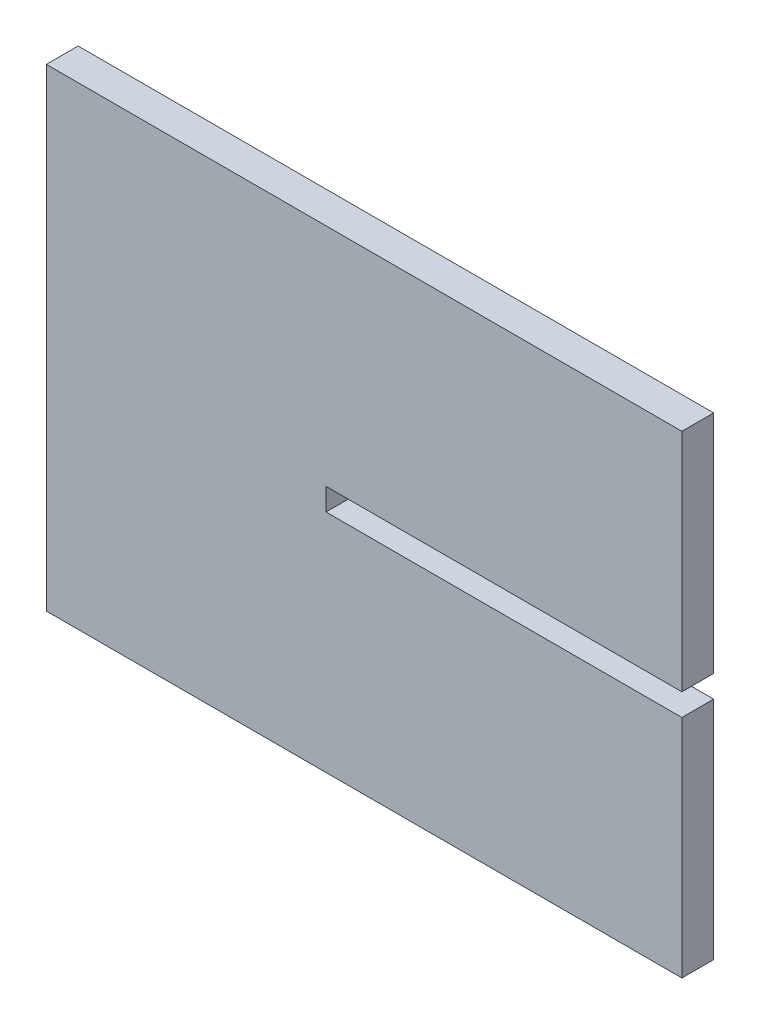
ISO-10303-21;
HEADER;
FILE_DESCRIPTION(('STEP AP214'),'2;1');
FILE_NAME('part.step','',(''),(''),'','','');
FILE_SCHEMA(('AUTOMOTIVE_DESIGN { 1 0 10303 214 1 1 1 1 }'));
ENDSEC;
DATA;
#1=APPLICATION_CONTEXT('core data for automotive mechanical design processes');
#2=APPLICATION_PROTOCOL_DEFINITION('international standard','automotive_design',2000,#1);
#3=PRODUCT_CONTEXT('',#1,'mechanical');
#4=PRODUCT('Part','Part','',(#3));
#5=PRODUCT_RELATED_PRODUCT_CATEGORY('part','',(#4));
#6=PRODUCT_DEFINITION_FORMATION('','',#4);
#7=PRODUCT_DEFINITION_CONTEXT('part definition',#1,'design');
#8=PRODUCT_DEFINITION('design','',#6,#7);
#9=PRODUCT_DEFINITION_SHAPE('','',#8);
#10=(LENGTH_UNIT() NAMED_UNIT(*) SI_UNIT(.MILLI.,.METRE.));
#11=(NAMED_UNIT(*) PLANE_ANGLE_UNIT() SI_UNIT($,.RADIAN.));
#12=(NAMED_UNIT(*) SI_UNIT($,.STERADIAN.) SOLID_ANGLE_UNIT());
#13=UNCERTAINTY_MEASURE_WITH_UNIT(LENGTH_MEASURE(1.E-05),#10,'distance_accuracy_value','');
#14=(GEOMETRIC_REPRESENTATION_CONTEXT(3) GLOBAL_UNCERTAINTY_ASSIGNED_CONTEXT((#13)) GLOBAL_UNIT_ASSIGNED_CONTEXT((#10,
#11,#12)) REPRESENTATION_CONTEXT('',''));
#15=CARTESIAN_POINT('',(0.,0.,0.));
#16=DIRECTION('',(0.,0.,1.));
#17=DIRECTION('',(1.,0.,0.));
#18=AXIS2_PLACEMENT_3D('',#15,#16,#17);
#19=CARTESIAN_POINT('',(0.,0.,-10.));
#20=DIRECTION('',(-1.,0.,0.));
#21=DIRECTION('',(0.,0.,1.));
#22=AXIS2_PLACEMENT_3D('',#19,#20,#21);
#23=PLANE('',#22);
#24=DIRECTION('',(0.,-1.,0.));
#25=VECTOR('',#24,1.);
#26=CARTESIAN_POINT('',(0.,0.,0.));
#27=LINE('',#26,#25);
#28=CARTESIAN_POINT('',(0.,0.,0.));
#29=VERTEX_POINT('',#28);
#30=CARTESIAN_POINT('',(0.,-149.,0.));
#31=VERTEX_POINT('',#30);
#32=EDGE_CURVE('E133',#29,#31,#27,.T.);
#33=ORIENTED_EDGE('',*,*,#32,.F.);
#34=DIRECTION('',(0.,0.,1.));
#35=VECTOR('',#34,1.);
#36=CARTESIAN_POINT('',(0.,0.,-10.));
#37=LINE('',#36,#35);
#38=CARTESIAN_POINT('',(0.,0.,-10.));
#39=VERTEX_POINT('',#38);
#40=EDGE_CURVE('E11',#39,#29,#37,.T.);
#41=ORIENTED_EDGE('',*,*,#40,.F.);
#42=DIRECTION('',(0.,-1.,0.));
#43=VECTOR('',#42,1.);
#44=CARTESIAN_POINT('',(0.,0.,-10.));
#45=LINE('',#44,#43);
#46=CARTESIAN_POINT('',(0.,-149.,-10.));
#47=VERTEX_POINT('',#46);
#48=EDGE_CURVE('E153',#39,#47,#45,.T.);
#49=ORIENTED_EDGE('',*,*,#48,.T.);
#50=DIRECTION('',(0.,0.,1.));
#51=VECTOR('',#50,1.);
#52=CARTESIAN_POINT('',(0.,-149.,-10.));
#53=LINE('',#52,#51);
#54=EDGE_CURVE('E39',#47,#31,#53,.T.);
#55=ORIENTED_EDGE('',*,*,#54,.T.);
#56=EDGE_LOOP('',(#33,#41,#49,#55));
#57=FACE_BOUND('',#56,.T.);
#58=ADVANCED_FACE('F36',(#57),#23,.T.);
#59=CARTESIAN_POINT('',(0.,0.,-10.));
#60=DIRECTION('',(0.,1.,0.));
#61=DIRECTION('',(0.,0.,1.));
#62=AXIS2_PLACEMENT_3D('',#59,#60,#61);
#63=PLANE('',#62);
#64=DIRECTION('',(-1.,0.,0.));
#65=VECTOR('',#64,1.);
#66=CARTESIAN_POINT('',(0.,0.,0.));
#67=LINE('',#66,#65);
#68=CARTESIAN_POINT('',(200.,0.,0.));
#69=VERTEX_POINT('',#68);
#70=EDGE_CURVE('E151',#69,#29,#67,.T.);
#71=ORIENTED_EDGE('',*,*,#70,.F.);
#72=DIRECTION('',(0.,0.,1.));
#73=VECTOR('',#72,1.);
#74=CARTESIAN_POINT('',(200.,0.,-10.));
#75=LINE('',#74,#73);
#76=CARTESIAN_POINT('',(200.,0.,-10.));
#77=VERTEX_POINT('',#76);
#78=EDGE_CURVE('E45',#77,#69,#75,.T.);
#79=ORIENTED_EDGE('',*,*,#78,.F.);
#80=DIRECTION('',(-1.,0.,0.));
#81=VECTOR('',#80,1.);
#82=CARTESIAN_POINT('',(0.,0.,-10.));
#83=LINE('',#82,#81);
#84=EDGE_CURVE('E123',#77,#39,#83,.T.);
#85=ORIENTED_EDGE('',*,*,#84,.T.);
#86=ORIENTED_EDGE('',*,*,#40,.T.);
#87=EDGE_LOOP('',(#71,#79,#85,#86));
#88=FACE_BOUND('',#87,.T.);
#89=ADVANCED_FACE('F165',(#88),#63,.T.);
#90=CARTESIAN_POINT('',(200.,0.,-10.));
#91=DIRECTION('',(1.,0.,0.));
#92=DIRECTION('',(0.,0.,-1.));
#93=AXIS2_PLACEMENT_3D('',#90,#91,#92);
#94=PLANE('',#93);
#95=DIRECTION('',(0.,1.,0.));
#96=VECTOR('',#95,1.);
#97=CARTESIAN_POINT('',(200.,0.,0.));
#98=LINE('',#97,#96);
#99=CARTESIAN_POINT('',(200.,-71.,0.));
#100=VERTEX_POINT('',#99);
#101=EDGE_CURVE('E110',#100,#69,#98,.T.);
#102=ORIENTED_EDGE('',*,*,#101,.F.);
#103=DIRECTION('',(0.,0.,1.));
#104=VECTOR('',#103,1.);
#105=CARTESIAN_POINT('',(200.,-71.,-10.));
#106=LINE('',#105,#104);
#107=CARTESIAN_POINT('',(200.,-71.,-10.));
#108=VERTEX_POINT('',#107);
#109=EDGE_CURVE('E105',#108,#100,#106,.T.);
#110=ORIENTED_EDGE('',*,*,#109,.F.);
#111=DIRECTION('',(0.,1.,0.));
#112=VECTOR('',#111,1.);
#113=CARTESIAN_POINT('',(200.,0.,-10.));
#114=LINE('',#113,#112);
#115=EDGE_CURVE('E108',#108,#77,#114,.T.);
#116=ORIENTED_EDGE('',*,*,#115,.T.);
#117=ORIENTED_EDGE('',*,*,#78,.T.);
#118=EDGE_LOOP('',(#102,#110,#116,#117));
#119=FACE_BOUND('',#118,.T.);
#120=ADVANCED_FACE('F107',(#119),#94,.T.);
#121=CARTESIAN_POINT('',(200.,-71.,-10.));
#122=DIRECTION('',(0.,-1.,0.));
#123=DIRECTION('',(0.,0.,-1.));
#124=AXIS2_PLACEMENT_3D('',#121,#122,#123);
#125=PLANE('',#124);
#126=DIRECTION('',(1.,0.,0.));
#127=VECTOR('',#126,1.);
#128=CARTESIAN_POINT('',(200.,-71.,0.));
#129=LINE('',#128,#127);
#130=CARTESIAN_POINT('',(88.,-71.,0.));
#131=VERTEX_POINT('',#130);
#132=EDGE_CURVE('E148',#131,#100,#129,.T.);
#133=ORIENTED_EDGE('',*,*,#132,.F.);
#134=DIRECTION('',(0.,0.,1.));
#135=VECTOR('',#134,1.);
#136=CARTESIAN_POINT('',(88.,-71.,-10.));
#137=LINE('',#136,#135);
#138=CARTESIAN_POINT('',(88.,-71.,-10.));
#139=VERTEX_POINT('',#138);
#140=EDGE_CURVE('E115',#139,#131,#137,.T.);
#141=ORIENTED_EDGE('',*,*,#140,.F.);
#142=DIRECTION('',(1.,0.,0.));
#143=VECTOR('',#142,1.);
#144=CARTESIAN_POINT('',(200.,-71.,-10.));
#145=LINE('',#144,#143);
#146=EDGE_CURVE('E121',#139,#108,#145,.T.);
#147=ORIENTED_EDGE('',*,*,#146,.T.);
#148=ORIENTED_EDGE('',*,*,#109,.T.);
#149=EDGE_LOOP('',(#133,#141,#147,#148));
#150=FACE_BOUND('',#149,.T.);
#151=ADVANCED_FACE('F125',(#150),#125,.T.);
#152=CARTESIAN_POINT('',(88.,-71.,-10.));
#153=DIRECTION('',(1.,0.,0.));
#154=DIRECTION('',(0.,0.,-1.));
#155=AXIS2_PLACEMENT_3D('',#152,#153,#154);
#156=PLANE('',#155);
#157=DIRECTION('',(0.,1.,0.));
#158=VECTOR('',#157,1.);
#159=CARTESIAN_POINT('',(88.,-71.,0.));
#160=LINE('',#159,#158);
#161=CARTESIAN_POINT('',(88.,-78.,0.));
#162=VERTEX_POINT('',#161);
#163=EDGE_CURVE('E145',#162,#131,#160,.T.);
#164=ORIENTED_EDGE('',*,*,#163,.F.);
#165=DIRECTION('',(0.,0.,1.));
#166=VECTOR('',#165,1.);
#167=CARTESIAN_POINT('',(88.,-78.,-10.));
#168=LINE('',#167,#166);
#169=CARTESIAN_POINT('',(88.,-78.,-10.));
#170=VERTEX_POINT('',#169);
#171=EDGE_CURVE('E157',#170,#162,#168,.T.);
#172=ORIENTED_EDGE('',*,*,#171,.F.);
#173=DIRECTION('',(0.,1.,0.));
#174=VECTOR('',#173,1.);
#175=CARTESIAN_POINT('',(88.,-71.,-10.));
#176=LINE('',#175,#174);
#177=EDGE_CURVE('E126',#170,#139,#176,.T.);
#178=ORIENTED_EDGE('',*,*,#177,.T.);
#179=ORIENTED_EDGE('',*,*,#140,.T.);
#180=EDGE_LOOP('',(#164,#172,#178,#179));
#181=FACE_BOUND('',#180,.T.);
#182=ADVANCED_FACE('F178',(#181),#156,.T.);
#183=CARTESIAN_POINT('',(200.,-78.,-10.));
#184=DIRECTION('',(0.,1.,0.));
#185=DIRECTION('',(0.,0.,1.));
#186=AXIS2_PLACEMENT_3D('',#183,#184,#185);
#187=PLANE('',#186);
#188=DIRECTION('',(-1.,0.,0.));
#189=VECTOR('',#188,1.);
#190=CARTESIAN_POINT('',(200.,-78.,0.));
#191=LINE('',#190,#189);
#192=CARTESIAN_POINT('',(200.,-78.,0.));
#193=VERTEX_POINT('',#192);
#194=EDGE_CURVE('E142',#193,#162,#191,.T.);
#195=ORIENTED_EDGE('',*,*,#194,.F.);
#196=DIRECTION('',(0.,0.,1.));
#197=VECTOR('',#196,1.);
#198=CARTESIAN_POINT('',(200.,-78.,-10.));
#199=LINE('',#198,#197);
#200=CARTESIAN_POINT('',(200.,-78.,-10.));
#201=VERTEX_POINT('',#200);
#202=EDGE_CURVE('E159',#201,#193,#199,.T.);
#203=ORIENTED_EDGE('',*,*,#202,.F.);
#204=DIRECTION('',(-1.,0.,0.));
#205=VECTOR('',#204,1.);
#206=CARTESIAN_POINT('',(200.,-78.,-10.));
#207=LINE('',#206,#205);
#208=EDGE_CURVE('E128',#201,#170,#207,.T.);
#209=ORIENTED_EDGE('',*,*,#208,.T.);
#210=ORIENTED_EDGE('',*,*,#171,.T.);
#211=EDGE_LOOP('',(#195,#203,#209,#210));
#212=FACE_BOUND('',#211,.T.);
#213=ADVANCED_FACE('F181',(#212),#187,.T.);
#214=CARTESIAN_POINT('',(200.,-78.,-10.));
#215=DIRECTION('',(1.,0.,0.));
#216=DIRECTION('',(0.,0.,-1.));
#217=AXIS2_PLACEMENT_3D('',#214,#215,#216);
#218=PLANE('',#217);
#219=DIRECTION('',(0.,1.,0.));
#220=VECTOR('',#219,1.);
#221=CARTESIAN_POINT('',(200.,-78.,0.));
#222=LINE('',#221,#220);
#223=CARTESIAN_POINT('',(200.,-149.,0.));
#224=VERTEX_POINT('',#223);
#225=EDGE_CURVE('E139',#224,#193,#222,.T.);
#226=ORIENTED_EDGE('',*,*,#225,.F.);
#227=DIRECTION('',(0.,0.,1.));
#228=VECTOR('',#227,1.);
#229=CARTESIAN_POINT('',(200.,-149.,-10.));
#230=LINE('',#229,#228);
#231=CARTESIAN_POINT('',(200.,-149.,-10.));
#232=VERTEX_POINT('',#231);
#233=EDGE_CURVE('E160',#232,#224,#230,.T.);
#234=ORIENTED_EDGE('',*,*,#233,.F.);
#235=DIRECTION('',(0.,1.,0.));
#236=VECTOR('',#235,1.);
#237=CARTESIAN_POINT('',(200.,-78.,-10.));
#238=LINE('',#237,#236);
#239=EDGE_CURVE('E276',#232,#201,#238,.T.);
#240=ORIENTED_EDGE('',*,*,#239,.T.);
#241=ORIENTED_EDGE('',*,*,#202,.T.);
#242=EDGE_LOOP('',(#226,#234,#240,#241));
#243=FACE_BOUND('',#242,.T.);
#244=ADVANCED_FACE('F185',(#243),#218,.T.);
#245=CARTESIAN_POINT('',(0.,-149.,-10.));
#246=DIRECTION('',(0.,-1.,0.));
#247=DIRECTION('',(0.,0.,-1.));
#248=AXIS2_PLACEMENT_3D('',#245,#246,#247);
#249=PLANE('',#248);
#250=DIRECTION('',(1.,0.,0.));
#251=VECTOR('',#250,1.);
#252=CARTESIAN_POINT('',(0.,-149.,0.));
#253=LINE('',#252,#251);
#254=EDGE_CURVE('E136',#31,#224,#253,.T.);
#255=ORIENTED_EDGE('',*,*,#254,.F.);
#256=ORIENTED_EDGE('',*,*,#54,.F.);
#257=DIRECTION('',(1.,0.,0.));
#258=VECTOR('',#257,1.);
#259=CARTESIAN_POINT('',(0.,-149.,-10.));
#260=LINE('',#259,#258);
#261=EDGE_CURVE('E277',#47,#232,#260,.T.);
#262=ORIENTED_EDGE('',*,*,#261,.T.);
#263=ORIENTED_EDGE('',*,*,#233,.T.);
#264=EDGE_LOOP('',(#255,#256,#262,#263));
#265=FACE_BOUND('',#264,.T.);
#266=ADVANCED_FACE('F162',(#265),#249,.T.);
#267=CARTESIAN_POINT('',(0.,0.,-10.));
#268=DIRECTION('',(0.,0.,1.));
#269=DIRECTION('',(1.,0.,0.));
#270=AXIS2_PLACEMENT_3D('',#267,#268,#269);
#271=PLANE('',#270);
#272=ORIENTED_EDGE('',*,*,#48,.F.);
#273=ORIENTED_EDGE('',*,*,#84,.F.);
#274=ORIENTED_EDGE('',*,*,#115,.F.);
#275=ORIENTED_EDGE('',*,*,#146,.F.);
#276=ORIENTED_EDGE('',*,*,#177,.F.);
#277=ORIENTED_EDGE('',*,*,#208,.F.);
#278=ORIENTED_EDGE('',*,*,#239,.F.);
#279=ORIENTED_EDGE('',*,*,#261,.F.);
#280=EDGE_LOOP('',(#272,#273,#274,#275,#276,#277,#278,#279));
#281=FACE_BOUND('',#280,.T.);
#282=ADVANCED_FACE('F119',(#281),#271,.F.);
#283=CARTESIAN_POINT('',(0.,0.,0.));
#284=DIRECTION('',(0.,0.,1.));
#285=DIRECTION('',(1.,0.,0.));
#286=AXIS2_PLACEMENT_3D('',#283,#284,#285);
#287=PLANE('',#286);
#288=ORIENTED_EDGE('',*,*,#32,.T.);
#289=ORIENTED_EDGE('',*,*,#254,.T.);
#290=ORIENTED_EDGE('',*,*,#225,.T.);
#291=ORIENTED_EDGE('',*,*,#194,.T.);
#292=ORIENTED_EDGE('',*,*,#163,.T.);
#293=ORIENTED_EDGE('',*,*,#132,.T.);
#294=ORIENTED_EDGE('',*,*,#101,.T.);
#295=ORIENTED_EDGE('',*,*,#70,.T.);
#296=EDGE_LOOP('',(#288,#289,#290,#291,#292,#293,#294,#295));
#297=FACE_BOUND('',#296,.T.);
#298=ADVANCED_FACE('F164',(#297),#287,.T.);
#299=CLOSED_SHELL('',(#58,#89,#120,#151,#182,#213,#244,#266,#282,#298));
#300=MANIFOLD_SOLID_BREP('B2',#299);
#301=ADVANCED_BREP_SHAPE_REPRESENTATION('',(#18,#300),#14);
#302=SHAPE_DEFINITION_REPRESENTATION(#9,#301);
ENDSEC;
END-ISO-10303-21;
